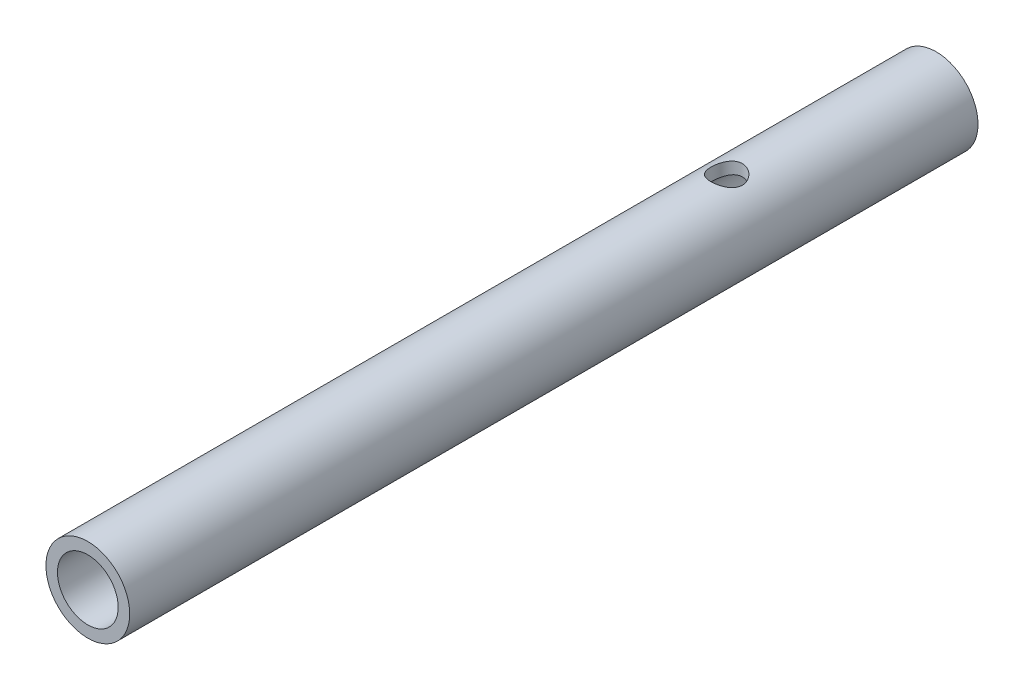
ISO-10303-21;
HEADER;
FILE_DESCRIPTION(('STEP AP214'),'2;1');
FILE_NAME('part.step','',(''),(''),'','','');
FILE_SCHEMA(('AUTOMOTIVE_DESIGN { 1 0 10303 214 1 1 1 1 }'));
ENDSEC;
DATA;
#1=APPLICATION_CONTEXT('core data for automotive mechanical design processes');
#2=APPLICATION_PROTOCOL_DEFINITION('international standard','automotive_design',2000,#1);
#3=PRODUCT_CONTEXT('',#1,'mechanical');
#4=PRODUCT('Part','Part','',(#3));
#5=PRODUCT_RELATED_PRODUCT_CATEGORY('part','',(#4));
#6=PRODUCT_DEFINITION_FORMATION('','',#4);
#7=PRODUCT_DEFINITION_CONTEXT('part definition',#1,'design');
#8=PRODUCT_DEFINITION('design','',#6,#7);
#9=PRODUCT_DEFINITION_SHAPE('','',#8);
#10=(LENGTH_UNIT() NAMED_UNIT(*) SI_UNIT(.MILLI.,.METRE.));
#11=(NAMED_UNIT(*) PLANE_ANGLE_UNIT() SI_UNIT($,.RADIAN.));
#12=(NAMED_UNIT(*) SI_UNIT($,.STERADIAN.) SOLID_ANGLE_UNIT());
#13=UNCERTAINTY_MEASURE_WITH_UNIT(LENGTH_MEASURE(1.E-05),#10,'distance_accuracy_value','');
#14=(GEOMETRIC_REPRESENTATION_CONTEXT(3) GLOBAL_UNCERTAINTY_ASSIGNED_CONTEXT((#13)) GLOBAL_UNIT_ASSIGNED_CONTEXT((#10,
#11,#12)) REPRESENTATION_CONTEXT('',''));
#15=CARTESIAN_POINT('',(0.,0.,0.));
#16=DIRECTION('',(0.,0.,1.));
#17=DIRECTION('',(1.,0.,0.));
#18=AXIS2_PLACEMENT_3D('',#15,#16,#17);
#19=CARTESIAN_POINT('',(0.,0.,81.));
#20=DIRECTION('',(0.,0.,1.));
#21=DIRECTION('',(1.,0.,0.));
#22=AXIS2_PLACEMENT_3D('',#19,#20,#21);
#23=PLANE('',#22);
#24=CARTESIAN_POINT('',(0.,0.,81.));
#25=DIRECTION('',(0.,0.,1.));
#26=DIRECTION('',(1.,0.,0.));
#27=AXIS2_PLACEMENT_3D('',#24,#25,#26);
#28=CIRCLE('',#27,4.);
#29=CARTESIAN_POINT('',(4.,0.,81.));
#30=VERTEX_POINT('',#29);
#31=EDGE_CURVE('E10',#30,#30,#28,.T.);
#32=ORIENTED_EDGE('',*,*,#31,.T.);
#33=EDGE_LOOP('',(#32));
#34=FACE_BOUND('',#33,.T.);
#35=CARTESIAN_POINT('',(0.,0.,81.));
#36=DIRECTION('',(0.,0.,1.));
#37=DIRECTION('',(1.,0.,0.));
#38=AXIS2_PLACEMENT_3D('',#35,#36,#37);
#39=CIRCLE('',#38,2.9);
#40=CARTESIAN_POINT('',(2.9,0.,81.));
#41=VERTEX_POINT('',#40);
#42=EDGE_CURVE('E50',#41,#41,#39,.T.);
#43=ORIENTED_EDGE('',*,*,#42,.F.);
#44=EDGE_LOOP('',(#43));
#45=FACE_BOUND('',#44,.T.);
#46=ADVANCED_FACE('F33',(#34,#45),#23,.T.);
#47=CARTESIAN_POINT('',(0.,0.,0.));
#48=DIRECTION('',(0.,0.,1.));
#49=DIRECTION('',(1.,0.,0.));
#50=AXIS2_PLACEMENT_3D('',#47,#48,#49);
#51=PLANE('',#50);
#52=CARTESIAN_POINT('',(0.,0.,0.));
#53=DIRECTION('',(0.,0.,1.));
#54=DIRECTION('',(1.,0.,0.));
#55=AXIS2_PLACEMENT_3D('',#52,#53,#54);
#56=CIRCLE('',#55,4.);
#57=CARTESIAN_POINT('',(4.,0.,0.));
#58=VERTEX_POINT('',#57);
#59=EDGE_CURVE('E45',#58,#58,#56,.T.);
#60=ORIENTED_EDGE('',*,*,#59,.F.);
#61=EDGE_LOOP('',(#60));
#62=FACE_BOUND('',#61,.T.);
#63=CARTESIAN_POINT('',(0.,0.,0.));
#64=DIRECTION('',(0.,0.,1.));
#65=DIRECTION('',(1.,0.,0.));
#66=AXIS2_PLACEMENT_3D('',#63,#64,#65);
#67=CIRCLE('',#66,2.9);
#68=CARTESIAN_POINT('',(2.9,0.,0.));
#69=VERTEX_POINT('',#68);
#70=EDGE_CURVE('E53',#69,#69,#67,.T.);
#71=ORIENTED_EDGE('',*,*,#70,.T.);
#72=EDGE_LOOP('',(#71));
#73=FACE_BOUND('',#72,.T.);
#74=ADVANCED_FACE('F104',(#62,#73),#51,.F.);
#75=CARTESIAN_POINT('',(0.,0.,81.));
#76=DIRECTION('',(0.,0.,-1.));
#77=DIRECTION('',(-1.,0.,0.));
#78=AXIS2_PLACEMENT_3D('',#75,#76,#77);
#79=CYLINDRICAL_SURFACE('',#78,4.);
#80=CARTESIAN_POINT('',(0.,-4.,21.5));
#81=CARTESIAN_POINT('',(-0.0812350589378493,-4.00000217456151,21.5000029023031));
#82=CARTESIAN_POINT('',(-0.162450241781789,-3.99750379283184,21.4933802397516));
#83=CARTESIAN_POINT('',(-0.322453452352357,-3.98778696006928,21.4671718047301));
#84=CARTESIAN_POINT('',(-0.401241827987612,-3.98056918893993,21.4475878995294));
#85=CARTESIAN_POINT('',(-0.554060784990876,-3.96218832391545,21.3962469982282));
#86=CARTESIAN_POINT('',(-0.628100224162276,-3.9510328434944,21.3645134831782));
#87=CARTESIAN_POINT('',(-0.769799310160252,-3.92588767765353,21.2898935869842));
#88=CARTESIAN_POINT('',(-0.837457239177877,-3.91189723227548,21.2470042144558));
#89=CARTESIAN_POINT('',(-0.967346417045822,-3.88186246971217,21.1493874689291));
#90=CARTESIAN_POINT('',(-1.02927073015119,-3.86576002583566,21.0942697377406));
#91=CARTESIAN_POINT('',(-1.14324421474363,-3.83360220871327,20.9745895653412));
#92=CARTESIAN_POINT('',(-1.19529036359202,-3.81754685135033,20.9100242439121));
#93=CARTESIAN_POINT('',(-1.28998202215985,-3.78662470617731,20.7702825324768));
#94=CARTESIAN_POINT('',(-1.33219393195759,-3.77182648820818,20.6947956334542));
#95=CARTESIAN_POINT('',(-1.40318646334084,-3.74599860237433,20.5371516458315));
#96=CARTESIAN_POINT('',(-1.43197244961239,-3.73496742975881,20.4549972368449));
#97=CARTESIAN_POINT('',(-1.47408431017549,-3.71854412824136,20.2898832597418));
#98=CARTESIAN_POINT('',(-1.48799593218558,-3.71293924350838,20.2070949615646));
#99=CARTESIAN_POINT('',(-1.50179556531648,-3.70738061461215,20.0401838420062));
#100=CARTESIAN_POINT('',(-1.5016893680263,-3.70742453659305,19.9560615861255));
#101=CARTESIAN_POINT('',(-1.48790429610018,-3.71297511632055,19.794230474787));
#102=CARTESIAN_POINT('',(-1.47503808509003,-3.71815468871122,19.7164390939558));
#103=CARTESIAN_POINT('',(-1.4374416786833,-3.7328493805953,19.5642128495947));
#104=CARTESIAN_POINT('',(-1.41270969663258,-3.74236515298863,19.4897784933861));
#105=CARTESIAN_POINT('',(-1.35163748571904,-3.76485702190253,19.3447229322718));
#106=CARTESIAN_POINT('',(-1.315086487371,-3.77789517988166,19.2742005138787));
#107=CARTESIAN_POINT('',(-1.23156073762697,-3.80594210139319,19.140054262409));
#108=CARTESIAN_POINT('',(-1.18458238728896,-3.82095154457158,19.0764328224803));
#109=CARTESIAN_POINT('',(-1.07781780766548,-3.85248038859113,18.9533963363491));
#110=CARTESIAN_POINT('',(-1.01738298716955,-3.86903347455671,18.8945513592519));
#111=CARTESIAN_POINT('',(-0.887312590819018,-3.90091728164086,18.7876620337942));
#112=CARTESIAN_POINT('',(-0.817675603497362,-3.91624781465952,18.7396193453943));
#113=CARTESIAN_POINT('',(-0.669723436992418,-3.9442639480908,18.6550696029375));
#114=CARTESIAN_POINT('',(-0.591290713844717,-3.95690498259616,18.6187524187789));
#115=CARTESIAN_POINT('',(-0.42883685052458,-3.97778718326962,18.56001739573));
#116=CARTESIAN_POINT('',(-0.344818210845764,-3.98603030341493,18.5375933834389));
#117=CARTESIAN_POINT('',(-0.178375243148662,-3.99684443228065,18.5083772124581));
#118=CARTESIAN_POINT('',(-0.0961036195622058,-3.99969369025686,18.5008173936175));
#119=CARTESIAN_POINT('',(0.068572475255028,-4.00025893700126,18.4993089361001));
#120=CARTESIAN_POINT('',(0.150976912983377,-3.99797606386863,18.5053572796832));
#121=CARTESIAN_POINT('',(0.310262048561863,-3.98871709772643,18.5303100423087));
#122=CARTESIAN_POINT('',(0.387233328007339,-3.98192470962305,18.5487115437371));
#123=CARTESIAN_POINT('',(0.536941754957224,-3.96451477091717,18.5971860725473));
#124=CARTESIAN_POINT('',(0.609678350347538,-3.9538967228203,18.627260617948));
#125=CARTESIAN_POINT('',(0.751247765110159,-3.92949624407681,18.6991864124395));
#126=CARTESIAN_POINT('',(0.819903083557799,-3.91563000209348,18.7413577292234));
#127=CARTESIAN_POINT('',(0.949392711726629,-3.88626671564664,18.8359181031716));
#128=CARTESIAN_POINT('',(1.01022412027046,-3.87076907009516,18.8883109325451));
#129=CARTESIAN_POINT('',(1.12603079874455,-3.83873329490989,19.0054041221243));
#130=CARTESIAN_POINT('',(1.18046154123569,-3.82218696503729,19.0706421827727));
#131=CARTESIAN_POINT('',(1.27771050031904,-3.79078815746853,19.2096513847077));
#132=CARTESIAN_POINT('',(1.32052767414519,-3.77593583194399,19.2834232913885));
#133=CARTESIAN_POINT('',(1.39337773518998,-3.74966829822463,19.4380159867723));
#134=CARTESIAN_POINT('',(1.42335685446919,-3.73826760328493,19.5188647459104));
#135=CARTESIAN_POINT('',(1.4690788346689,-3.72054032891005,19.6850097636878));
#136=CARTESIAN_POINT('',(1.48483050305536,-3.7142106105749,19.7703032361981));
#137=CARTESIAN_POINT('',(1.5008634709784,-3.70775894792573,19.9370161595411));
#138=CARTESIAN_POINT('',(1.50207331495838,-3.70726444523341,20.0183326317169));
#139=CARTESIAN_POINT('',(1.49136715641593,-3.71158412745292,20.1799453162762));
#140=CARTESIAN_POINT('',(1.47945239850124,-3.71639780898899,20.2602416246716));
#141=CARTESIAN_POINT('',(1.44355815630242,-3.73048141585432,20.4150472267166));
#142=CARTESIAN_POINT('',(1.41995798316525,-3.73961085376663,20.4896583462453));
#143=CARTESIAN_POINT('',(1.3616969677992,-3.76121548297845,20.6339055084944));
#144=CARTESIAN_POINT('',(1.32703332944945,-3.77369151995214,20.7035402880701));
#145=CARTESIAN_POINT('',(1.24552075938154,-3.80139723903964,20.8398267896976));
#146=CARTESIAN_POINT('',(1.19812832803011,-3.81673698440964,20.9061307967999));
#147=CARTESIAN_POINT('',(1.09334485729907,-3.84806246757177,21.0301415609712));
#148=CARTESIAN_POINT('',(1.03595064012809,-3.86404840943145,21.0878455747868));
#149=CARTESIAN_POINT('',(0.909080396784628,-3.89590424609881,21.1962019558218));
#150=CARTESIAN_POINT('',(0.839118644212998,-3.91172104900644,21.2463037534347));
#151=CARTESIAN_POINT('',(0.691213223200827,-3.9405451445703,21.3340226552766));
#152=CARTESIAN_POINT('',(0.613268934090628,-3.95355221851559,21.3716387877364));
#153=CARTESIAN_POINT('',(0.447999082002318,-3.9757429260668,21.4343768290483));
#154=CARTESIAN_POINT('',(0.360413422234214,-3.98473657158356,21.4588870646019));
#155=CARTESIAN_POINT('',(0.181875733606387,-3.99686242179587,21.4916929599207));
#156=CARTESIAN_POINT('',(0.0909254163648633,-3.99999756603967,21.4999967514873));
#157=CARTESIAN_POINT('',(0.,-4.,21.5));
#158=B_SPLINE_CURVE_WITH_KNOTS('',3,(#80,#81,#82,#83,#84,#85,#86,#87,#88,#89,#90,#91,#92,#93,
#94,#95,#96,#97,#98,#99,#100,#101,#102,#103,#104,#105,#106,#107,#108,#109,#110,#111,#112,#113,
#114,#115,#116,#117,#118,#119,#120,#121,#122,#123,#124,#125,#126,#127,#128,#129,#130,#131,#132,
#133,#134,#135,#136,#137,#138,#139,#140,#141,#142,#143,#144,#145,#146,#147,#148,#149,#150,#151,
#152,#153,#154,#155,#156,#157),.UNSPECIFIED.,.T.,.F.,(4,2,2,2,2,2,2,2,2,2,2,2,2,2,2,2,2,2,2,2,2,
2,2,2,2,2,2,2,2,2,2,2,2,2,2,2,2,2,4),(0.,0.24336980156056,0.486704549530461,0.729571369213575,
0.97250337960949,1.22473618582715,1.47704604925622,1.73896674501659,2.00078269352134,
2.25185874416902,2.50283106079707,2.73878345119972,2.9747713806059,3.21522408387019,
3.45575990744259,3.71246153335813,3.96920257905066,4.22991375286076,4.49050899698846,
4.73725019635926,4.98393668390521,5.2211443792384,5.45838293254454,5.702592218596,
5.94689180019868,6.20536519455659,6.46386178920141,6.72343066727205,6.98283874956507,
7.22558763480253,7.4683135021126,7.70363142426534,7.93900886656507,8.18672471884272,
8.43451941997063,8.6957232965404,8.95694749805103,9.22948515032043,9.50188601796128),.UNSPECIFIED.);
#159=CARTESIAN_POINT('',(0.,-4.,21.5));
#160=VERTEX_POINT('',#159);
#161=EDGE_CURVE('E59',#160,#160,#158,.T.);
#162=ORIENTED_EDGE('',*,*,#161,.F.);
#163=EDGE_LOOP('',(#162));
#164=FACE_BOUND('',#163,.T.);
#165=CARTESIAN_POINT('',(0.,4.,18.5));
#166=CARTESIAN_POINT('',(0.0812350589378568,4.00000217456151,18.4999970976969));
#167=CARTESIAN_POINT('',(0.162450241781796,3.99750379283184,18.5066197602484));
#168=CARTESIAN_POINT('',(0.322453452352365,3.98778696006928,18.5328281952699));
#169=CARTESIAN_POINT('',(0.40124182798762,3.98056918893993,18.5524121004706));
#170=CARTESIAN_POINT('',(0.554060784990883,3.96218832391545,18.6037530017718));
#171=CARTESIAN_POINT('',(0.628100224162282,3.9510328434944,18.6354865168218));
#172=CARTESIAN_POINT('',(0.769799310160258,3.92588767765353,18.7101064130158));
#173=CARTESIAN_POINT('',(0.837457239177885,3.91189723227548,18.7529957855442));
#174=CARTESIAN_POINT('',(0.967346417045831,3.88186246971216,18.8506125310709));
#175=CARTESIAN_POINT('',(1.0292707301512,3.86576002583566,18.9057302622594));
#176=CARTESIAN_POINT('',(1.14324421474364,3.83360220871327,19.0254104346588));
#177=CARTESIAN_POINT('',(1.19529036359203,3.81754685135033,19.0899757560879));
#178=CARTESIAN_POINT('',(1.28998202215986,3.78662470617731,19.2297174675232));
#179=CARTESIAN_POINT('',(1.3321939319576,3.77182648820818,19.3052043665458));
#180=CARTESIAN_POINT('',(1.40318646334085,3.74599860237433,19.4628483541685));
#181=CARTESIAN_POINT('',(1.4319724496124,3.73496742975881,19.5450027631551));
#182=CARTESIAN_POINT('',(1.4740843101755,3.71854412824136,19.7101167402582));
#183=CARTESIAN_POINT('',(1.48799593218558,3.71293924350838,19.7929050384354));
#184=CARTESIAN_POINT('',(1.50179556531648,3.70738061461214,19.9598161579938));
#185=CARTESIAN_POINT('',(1.50168936802631,3.70742453659304,20.0439384138745));
#186=CARTESIAN_POINT('',(1.48790429610019,3.71297511632054,20.205769525213));
#187=CARTESIAN_POINT('',(1.47503808509004,3.71815468871121,20.2835609060442));
#188=CARTESIAN_POINT('',(1.4374416786833,3.73284938059529,20.4357871504053));
#189=CARTESIAN_POINT('',(1.41270969663259,3.74236515298863,20.5102215066139));
#190=CARTESIAN_POINT('',(1.35163748571904,3.76485702190253,20.6552770677282));
#191=CARTESIAN_POINT('',(1.31508648737101,3.77789517988166,20.7257994861213));
#192=CARTESIAN_POINT('',(1.23156073762698,3.80594210139319,20.859945737591));
#193=CARTESIAN_POINT('',(1.18458238728897,3.82095154457158,20.9235671775197));
#194=CARTESIAN_POINT('',(1.07781780766549,3.85248038859113,21.0466036636509));
#195=CARTESIAN_POINT('',(1.01738298716956,3.8690334745567,21.1054486407481));
#196=CARTESIAN_POINT('',(0.887312590819026,3.90091728164085,21.2123379662058));
#197=CARTESIAN_POINT('',(0.817675603497369,3.91624781465952,21.2603806546057));
#198=CARTESIAN_POINT('',(0.669723436992425,3.9442639480908,21.3449303970625));
#199=CARTESIAN_POINT('',(0.591290713844724,3.95690498259616,21.3812475812211));
#200=CARTESIAN_POINT('',(0.428836850524588,3.97778718326962,21.43998260427));
#201=CARTESIAN_POINT('',(0.344818210845772,3.98603030341493,21.4624066165611));
#202=CARTESIAN_POINT('',(0.178375243148669,3.99684443228065,21.4916227875419));
#203=CARTESIAN_POINT('',(0.0961036195622128,3.99969369025686,21.4991826063825));
#204=CARTESIAN_POINT('',(-0.0685724752550212,4.00025893700126,21.5006910638999));
#205=CARTESIAN_POINT('',(-0.15097691298337,3.99797606386863,21.4946427203168));
#206=CARTESIAN_POINT('',(-0.310262048561857,3.98871709772643,21.4696899576913));
#207=CARTESIAN_POINT('',(-0.387233328007334,3.98192470962305,21.4512884562629));
#208=CARTESIAN_POINT('',(-0.536941754957218,3.96451477091717,21.4028139274527));
#209=CARTESIAN_POINT('',(-0.609678350347531,3.9538967228203,21.372739382052));
#210=CARTESIAN_POINT('',(-0.751247765110152,3.92949624407682,21.3008135875605));
#211=CARTESIAN_POINT('',(-0.819903083557793,3.91563000209348,21.2586422707766));
#212=CARTESIAN_POINT('',(-0.949392711726624,3.88626671564664,21.1640818968284));
#213=CARTESIAN_POINT('',(-1.01022412027045,3.87076907009516,21.1116890674549));
#214=CARTESIAN_POINT('',(-1.12603079874454,3.8387332949099,20.9945958778757));
#215=CARTESIAN_POINT('',(-1.18046154123568,3.82218696503729,20.9293578172273));
#216=CARTESIAN_POINT('',(-1.27771050031903,3.79078815746854,20.7903486152923));
#217=CARTESIAN_POINT('',(-1.32052767414518,3.77593583194399,20.7165767086115));
#218=CARTESIAN_POINT('',(-1.39337773518997,3.74966829822463,20.5619840132277));
#219=CARTESIAN_POINT('',(-1.42335685446918,3.73826760328493,20.4811352540896));
#220=CARTESIAN_POINT('',(-1.46907883466889,3.72054032891005,20.3149902363122));
#221=CARTESIAN_POINT('',(-1.48483050305535,3.71421061057491,20.2296967638019));
#222=CARTESIAN_POINT('',(-1.50086347097839,3.70775894792573,20.0629838404589));
#223=CARTESIAN_POINT('',(-1.50207331495837,3.70726444523341,19.9816673682831));
#224=CARTESIAN_POINT('',(-1.49136715641592,3.71158412745292,19.8200546837238));
#225=CARTESIAN_POINT('',(-1.47945239850123,3.71639780898899,19.7397583753284));
#226=CARTESIAN_POINT('',(-1.44355815630241,3.73048141585433,19.5849527732834));
#227=CARTESIAN_POINT('',(-1.41995798316524,3.73961085376663,19.5103416537547));
#228=CARTESIAN_POINT('',(-1.36169696779919,3.76121548297845,19.3660944915056));
#229=CARTESIAN_POINT('',(-1.32703332944944,3.77369151995215,19.2964597119299));
#230=CARTESIAN_POINT('',(-1.24552075938154,3.80139723903965,19.1601732103024));
#231=CARTESIAN_POINT('',(-1.1981283280301,3.81673698440964,19.0938692032001));
#232=CARTESIAN_POINT('',(-1.09334485729906,3.84806246757177,18.9698584390288));
#233=CARTESIAN_POINT('',(-1.03595064012808,3.86404840943145,18.9121544252132));
#234=CARTESIAN_POINT('',(-0.909080396784617,3.89590424609881,18.8037980441782));
#235=CARTESIAN_POINT('',(-0.839118644212987,3.91172104900645,18.7536962465653));
#236=CARTESIAN_POINT('',(-0.691213223200817,3.94054514457031,18.6659773447234));
#237=CARTESIAN_POINT('',(-0.613268934090618,3.95355221851559,18.6283612122636));
#238=CARTESIAN_POINT('',(-0.447999082002309,3.9757429260668,18.5656231709517));
#239=CARTESIAN_POINT('',(-0.360413422234205,3.98473657158356,18.5411129353981));
#240=CARTESIAN_POINT('',(-0.181875733606378,3.99686242179587,18.5083070400793));
#241=CARTESIAN_POINT('',(-0.0909254163648552,3.99999756603967,18.5000032485127));
#242=CARTESIAN_POINT('',(0.,4.,18.5));
#243=B_SPLINE_CURVE_WITH_KNOTS('',3,(#165,#166,#167,#168,#169,#170,#171,#172,#173,#174,#175,
#176,#177,#178,#179,#180,#181,#182,#183,#184,#185,#186,#187,#188,#189,#190,#191,#192,#193,#194,
#195,#196,#197,#198,#199,#200,#201,#202,#203,#204,#205,#206,#207,#208,#209,#210,#211,#212,#213,
#214,#215,#216,#217,#218,#219,#220,#221,#222,#223,#224,#225,#226,#227,#228,#229,#230,#231,#232,
#233,#234,#235,#236,#237,#238,#239,#240,#241,#242),.UNSPECIFIED.,.T.,.F.,(4,2,2,2,2,2,2,2,2,2,2,
2,2,2,2,2,2,2,2,2,2,2,2,2,2,2,2,2,2,2,2,2,2,2,2,2,2,2,4),(0.,0.24336980156056,0.486704549530461,
0.729571369213573,0.972503379609491,1.22473618582715,1.47704604925622,1.73896674501659,
2.00078269352134,2.25185874416902,2.50283106079707,2.73878345119972,2.9747713806059,
3.21522408387019,3.45575990744259,3.71246153335813,3.96920257905066,4.22991375286076,
4.49050899698846,4.73725019635926,4.98393668390521,5.22114437923841,5.45838293254454,
5.702592218596,5.94689180019869,6.20536519455658,6.46386178920142,6.72343066727205,
6.98283874956508,7.22558763480253,7.4683135021126,7.70363142426535,7.93900886656507,
8.18672471884272,8.43451941997063,8.6957232965404,8.95694749805103,9.22948515032043,
9.50188601796129),.UNSPECIFIED.);
#244=CARTESIAN_POINT('',(0.,4.,18.5));
#245=VERTEX_POINT('',#244);
#246=EDGE_CURVE('E80',#245,#245,#243,.T.);
#247=ORIENTED_EDGE('',*,*,#246,.T.);
#248=EDGE_LOOP('',(#247));
#249=FACE_BOUND('',#248,.T.);
#250=ORIENTED_EDGE('',*,*,#31,.F.);
#251=EDGE_LOOP('',(#250));
#252=FACE_BOUND('',#251,.T.);
#253=ORIENTED_EDGE('',*,*,#59,.T.);
#254=EDGE_LOOP('',(#253));
#255=FACE_BOUND('',#254,.T.);
#256=ADVANCED_FACE('F35',(#164,#249,#252,#255),#79,.T.);
#257=CARTESIAN_POINT('',(0.,0.,81.));
#258=DIRECTION('',(0.,0.,-1.));
#259=DIRECTION('',(-1.,0.,0.));
#260=AXIS2_PLACEMENT_3D('',#257,#258,#259);
#261=CYLINDRICAL_SURFACE('',#260,2.9);
#262=CARTESIAN_POINT('',(0.,-2.9,21.5));
#263=CARTESIAN_POINT('',(0.0785281053013056,-2.8999955161642,21.4999949093055));
#264=CARTESIAN_POINT('',(0.157139881791002,-2.89677669061094,21.4937972489547));
#265=CARTESIAN_POINT('',(0.312019206028309,-2.88421715417955,21.4692906361974));
#266=CARTESIAN_POINT('',(0.388282481423316,-2.87486590515394,21.4509608350375));
#267=CARTESIAN_POINT('',(0.535992300960559,-2.85101535462591,21.4031092795851));
#268=CARTESIAN_POINT('',(0.607456668638787,-2.83653651815397,21.3736319854578));
#269=CARTESIAN_POINT('',(0.744307923623687,-2.80374117775437,21.3045637666606));
#270=CARTESIAN_POINT('',(0.809695022052255,-2.78542480721309,21.264973193501));
#271=CARTESIAN_POINT('',(0.937199253652447,-2.7452512159075,21.1739576513413));
#272=CARTESIAN_POINT('',(0.998845999295431,-2.72324310324875,21.1219413743298));
#273=CARTESIAN_POINT('',(1.11297880929229,-2.67862657216473,21.0088321914973));
#274=CARTESIAN_POINT('',(1.16545736370434,-2.65601767892338,20.9477319198234));
#275=CARTESIAN_POINT('',(1.2642199755428,-2.61054547351333,20.8120163094887));
#276=CARTESIAN_POINT('',(1.30960663376335,-2.58782191954358,20.7366953769526));
#277=CARTESIAN_POINT('',(1.38687899119835,-2.54725016043672,20.5782058726435));
#278=CARTESIAN_POINT('',(1.41877478489652,-2.52939831362628,20.4950432255868));
#279=CARTESIAN_POINT('',(1.46600730380236,-2.50230456867866,20.3284027445208));
#280=CARTESIAN_POINT('',(1.48224103407722,-2.4926010543748,20.2452582194879));
#281=CARTESIAN_POINT('',(1.50041031054414,-2.48171205655829,20.076907882029));
#282=CARTESIAN_POINT('',(1.50236187998017,-2.48051702736479,19.991704487213));
#283=CARTESIAN_POINT('',(1.49256730162753,-2.48641408378851,19.83360579867));
#284=CARTESIAN_POINT('',(1.48257162314017,-2.49244737896204,19.7605524436353));
#285=CARTESIAN_POINT('',(1.45222064348666,-2.51025132899941,19.6173588543817));
#286=CARTESIAN_POINT('',(1.43186162800651,-2.52202404085829,19.5472196743852));
#287=CARTESIAN_POINT('',(1.38101731867427,-2.5502251788653,19.4098445432735));
#288=CARTESIAN_POINT('',(1.35030974552706,-2.56675452350768,19.34271256666));
#289=CARTESIAN_POINT('',(1.27981618141518,-2.60262044910504,19.214222080244));
#290=CARTESIAN_POINT('',(1.24002611749046,-2.62195828808419,19.1528661781577));
#291=CARTESIAN_POINT('',(1.14615167307872,-2.66445806593622,19.0288229046281));
#292=CARTESIAN_POINT('',(1.09085591565219,-2.68778100876222,18.9671041419278));
#293=CARTESIAN_POINT('',(0.970643304321419,-2.73349383876559,18.8533956930842));
#294=CARTESIAN_POINT('',(0.90572125285781,-2.75588321345865,18.8014112973796));
#295=CARTESIAN_POINT('',(0.763773565769116,-2.79864653823148,18.7060386474362));
#296=CARTESIAN_POINT('',(0.686289237319935,-2.81885114084246,18.6632508498363));
#297=CARTESIAN_POINT('',(0.523915902480573,-2.85348555203439,18.5916801988097));
#298=CARTESIAN_POINT('',(0.439033227205564,-2.86792024023891,18.562885506931));
#299=CARTESIAN_POINT('',(0.272143849618,-2.88831848701327,18.52261845469));
#300=CARTESIAN_POINT('',(0.190524174433777,-2.89490714089137,18.5098624458529));
#301=CARTESIAN_POINT('',(0.0260506151767444,-2.90104794643901,18.4979652044286));
#302=CARTESIAN_POINT('',(-0.0568025978497374,-2.90060379359961,18.4988168215176));
#303=CARTESIAN_POINT('',(-0.21395857752755,-2.89307669107186,18.5134189883097));
#304=CARTESIAN_POINT('',(-0.288393936908829,-2.88655582152856,18.5260775179174));
#305=CARTESIAN_POINT('',(-0.433918921364024,-2.86829119082404,18.5621765908337));
#306=CARTESIAN_POINT('',(-0.505008187755273,-2.85654687114143,18.5856182871498));
#307=CARTESIAN_POINT('',(-0.644059286710559,-2.82849030850558,18.6431639090429));
#308=CARTESIAN_POINT('',(-0.711885482311183,-2.81206364817789,18.6775377780052));
#309=CARTESIAN_POINT('',(-0.841018103900149,-2.77618209247274,18.7556567254803));
#310=CARTESIAN_POINT('',(-0.9023218409037,-2.75672595622727,18.799405646773));
#311=CARTESIAN_POINT('',(-1.02339228433633,-2.71425791146629,18.9002280952274));
#312=CARTESIAN_POINT('',(-1.08234686310622,-2.69108627946765,18.9582109686823));
#313=CARTESIAN_POINT('',(-1.19008310166712,-2.64521038406813,19.0832022793398));
#314=CARTESIAN_POINT('',(-1.23885649930177,-2.62250651362312,19.1502179747774));
#315=CARTESIAN_POINT('',(-1.32754748731324,-2.57879895961146,19.2962077224052));
#316=CARTESIAN_POINT('',(-1.36678932227871,-2.55796967903992,19.3756493533152));
#317=CARTESIAN_POINT('',(-1.43093282162708,-2.5226553576514,19.5414144206756));
#318=CARTESIAN_POINT('',(-1.45585409805668,-2.50816164679831,19.6277282601616));
#319=CARTESIAN_POINT('',(-1.48825473914737,-2.48906017384358,19.7958167193738));
#320=CARTESIAN_POINT('',(-1.49719888083394,-2.48362569622652,19.8772123180777));
#321=CARTESIAN_POINT('',(-1.50167206738314,-2.48092594814788,20.0404891613269));
#322=CARTESIAN_POINT('',(-1.49720844877152,-2.48365621005941,20.1223701158206));
#323=CARTESIAN_POINT('',(-1.47638457222973,-2.49607773472421,20.2748943730617));
#324=CARTESIAN_POINT('',(-1.46136614065821,-2.50498247167155,20.3457938012452));
#325=CARTESIAN_POINT('',(-1.42160184628089,-2.5277598805951,20.4839625414034));
#326=CARTESIAN_POINT('',(-1.39685264834014,-2.54163425572605,20.5512305997582));
#327=CARTESIAN_POINT('',(-1.33651378721703,-2.57390208275202,20.6851878415328));
#328=CARTESIAN_POINT('',(-1.30031422338288,-2.59253415050249,20.7515429967162));
#329=CARTESIAN_POINT('',(-1.21874055222675,-2.63186658421079,20.8776786099426));
#330=CARTESIAN_POINT('',(-1.17336153823221,-2.65256805331531,20.9374555252354));
#331=CARTESIAN_POINT('',(-1.06764370910757,-2.69700627867627,21.0570354704521));
#332=CARTESIAN_POINT('',(-1.00611723433214,-2.72077992412558,21.115780629239));
#333=CARTESIAN_POINT('',(-0.873495381412511,-2.76620981769611,21.2223931052667));
#334=CARTESIAN_POINT('',(-0.802394402338922,-2.78786481354253,21.2702540109981));
#335=CARTESIAN_POINT('',(-0.650966139555165,-2.82709239718685,21.3541973275044));
#336=CARTESIAN_POINT('',(-0.570514241110525,-2.84459739009977,21.3900881426314));
#337=CARTESIAN_POINT('',(-0.403626301400708,-2.87301141600329,21.4473491545109));
#338=CARTESIAN_POINT('',(-0.31720750528563,-2.88393863781422,21.4687594132992));
#339=CARTESIAN_POINT('',(-0.191520528992023,-2.89392110622578,21.4882196873764));
#340=CARTESIAN_POINT('',(-0.153393383514174,-2.89619380045097,21.4926300562864));
#341=CARTESIAN_POINT('',(-0.0768508447254467,-2.89923436279848,21.4985214937596));
#342=CARTESIAN_POINT('',(-0.03843544448089,-2.90000219460563,21.5000024916315));
#343=CARTESIAN_POINT('',(0.,-2.9,21.5));
#344=B_SPLINE_CURVE_WITH_KNOTS('',3,(#262,#263,#264,#265,#266,#267,#268,#269,#270,#271,#272,
#273,#274,#275,#276,#277,#278,#279,#280,#281,#282,#283,#284,#285,#286,#287,#288,#289,#290,#291,
#292,#293,#294,#295,#296,#297,#298,#299,#300,#301,#302,#303,#304,#305,#306,#307,#308,#309,#310,
#311,#312,#313,#314,#315,#316,#317,#318,#319,#320,#321,#322,#323,#324,#325,#326,#327,#328,#329,
#330,#331,#332,#333,#334,#335,#336,#337,#338,#339,#340,#341,#342,#343),.UNSPECIFIED.,.T.,.F.,(4,
2,2,2,2,2,2,2,2,2,2,2,2,2,2,2,2,2,2,2,2,2,2,2,2,2,2,2,2,2,2,2,2,2,2,2,2,2,2,2,4),(0.,
0.235428837968244,0.471263308068689,0.706166940145712,0.941062408712166,1.19085521437965,
1.440851683159,1.71196047408964,1.98286604857864,2.23712678830275,2.49110222754838,
2.71200795412713,2.93299291112784,3.15906400452884,3.38523667731432,3.64238669336772,
3.89967606237957,4.17058054896784,4.44125544411106,4.68850125708556,4.93561715544778,
5.16192793557688,5.38826291997838,5.62068853200102,5.85320959679924,6.10973677333855,
6.36647132248036,6.63806187504124,6.90927959162382,7.15402989770007,7.39864630447289,
7.61675046395384,7.83492944198129,8.06757275129015,8.30034074511954,8.56412475442971,
8.82806374892545,9.09604461557823,9.36328101758283,9.47850847199804,9.59373870703568),.UNSPECIFIED.);
#345=CARTESIAN_POINT('',(0.,-2.9,21.5));
#346=VERTEX_POINT('',#345);
#347=EDGE_CURVE('E37',#346,#346,#344,.T.);
#348=ORIENTED_EDGE('',*,*,#347,.F.);
#349=EDGE_LOOP('',(#348));
#350=FACE_BOUND('',#349,.T.);
#351=CARTESIAN_POINT('',(0.,2.9,21.5));
#352=CARTESIAN_POINT('',(-0.078528105301298,2.8999955161642,21.4999949093055));
#353=CARTESIAN_POINT('',(-0.157139881790995,2.89677669061094,21.4937972489547));
#354=CARTESIAN_POINT('',(-0.312019206028301,2.88421715417955,21.4692906361974));
#355=CARTESIAN_POINT('',(-0.388282481423309,2.87486590515394,21.4509608350375));
#356=CARTESIAN_POINT('',(-0.535992300960551,2.85101535462591,21.4031092795851));
#357=CARTESIAN_POINT('',(-0.60745666863878,2.83653651815398,21.3736319854578));
#358=CARTESIAN_POINT('',(-0.744307923623679,2.80374117775438,21.3045637666606));
#359=CARTESIAN_POINT('',(-0.809695022052248,2.78542480721309,21.264973193501));
#360=CARTESIAN_POINT('',(-0.937199253652438,2.74525121590751,21.1739576513413));
#361=CARTESIAN_POINT('',(-0.998845999295422,2.72324310324875,21.1219413743298));
#362=CARTESIAN_POINT('',(-1.11297880929228,2.67862657216473,21.0088321914973));
#363=CARTESIAN_POINT('',(-1.16545736370433,2.65601767892338,20.9477319198234));
#364=CARTESIAN_POINT('',(-1.26421997554279,2.61054547351333,20.8120163094887));
#365=CARTESIAN_POINT('',(-1.30960663376334,2.58782191954359,20.7366953769526));
#366=CARTESIAN_POINT('',(-1.38687899119834,2.54725016043673,20.5782058726435));
#367=CARTESIAN_POINT('',(-1.41877478489651,2.52939831362628,20.4950432255868));
#368=CARTESIAN_POINT('',(-1.46600730380235,2.50230456867867,20.3284027445208));
#369=CARTESIAN_POINT('',(-1.48224103407721,2.4926010543748,20.2452582194879));
#370=CARTESIAN_POINT('',(-1.50041031054413,2.4817120565583,20.076907882029));
#371=CARTESIAN_POINT('',(-1.50236187998016,2.48051702736479,19.991704487213));
#372=CARTESIAN_POINT('',(-1.49256730162752,2.48641408378852,19.83360579867));
#373=CARTESIAN_POINT('',(-1.48257162314017,2.49244737896204,19.7605524436353));
#374=CARTESIAN_POINT('',(-1.45222064348665,2.51025132899941,19.6173588543817));
#375=CARTESIAN_POINT('',(-1.43186162800651,2.52202404085829,19.5472196743852));
#376=CARTESIAN_POINT('',(-1.38101731867426,2.5502251788653,19.4098445432735));
#377=CARTESIAN_POINT('',(-1.35030974552705,2.56675452350769,19.34271256666));
#378=CARTESIAN_POINT('',(-1.27981618141517,2.60262044910504,19.214222080244));
#379=CARTESIAN_POINT('',(-1.24002611749045,2.62195828808419,19.1528661781577));
#380=CARTESIAN_POINT('',(-1.14615167307871,2.66445806593623,19.0288229046281));
#381=CARTESIAN_POINT('',(-1.09085591565218,2.68778100876222,18.9671041419278));
#382=CARTESIAN_POINT('',(-0.970643304321409,2.73349383876559,18.8533956930842));
#383=CARTESIAN_POINT('',(-0.905721252857801,2.75588321345865,18.8014112973796));
#384=CARTESIAN_POINT('',(-0.763773565769107,2.79864653823148,18.7060386474362));
#385=CARTESIAN_POINT('',(-0.686289237319926,2.81885114084247,18.6632508498363));
#386=CARTESIAN_POINT('',(-0.523915902480564,2.85348555203439,18.5916801988097));
#387=CARTESIAN_POINT('',(-0.439033227205555,2.86792024023891,18.562885506931));
#388=CARTESIAN_POINT('',(-0.272143849617991,2.88831848701327,18.52261845469));
#389=CARTESIAN_POINT('',(-0.190524174433768,2.89490714089137,18.5098624458529));
#390=CARTESIAN_POINT('',(-0.0260506151767358,2.90104794643901,18.4979652044286));
#391=CARTESIAN_POINT('',(0.0568025978497457,2.90060379359961,18.4988168215176));
#392=CARTESIAN_POINT('',(0.213958577527558,2.89307669107186,18.5134189883097));
#393=CARTESIAN_POINT('',(0.288393936908837,2.88655582152856,18.5260775179174));
#394=CARTESIAN_POINT('',(0.433918921364032,2.86829119082404,18.5621765908337));
#395=CARTESIAN_POINT('',(0.505008187755281,2.85654687114143,18.5856182871498));
#396=CARTESIAN_POINT('',(0.644059286710567,2.82849030850558,18.6431639090429));
#397=CARTESIAN_POINT('',(0.711885482311191,2.81206364817789,18.6775377780052));
#398=CARTESIAN_POINT('',(0.841018103900157,2.77618209247274,18.7556567254803));
#399=CARTESIAN_POINT('',(0.902321840903708,2.75672595622726,18.799405646773));
#400=CARTESIAN_POINT('',(1.02339228433634,2.71425791146629,18.9002280952274));
#401=CARTESIAN_POINT('',(1.08234686310623,2.69108627946765,18.9582109686823));
#402=CARTESIAN_POINT('',(1.19008310166713,2.64521038406813,19.0832022793398));
#403=CARTESIAN_POINT('',(1.23885649930178,2.62250651362312,19.1502179747774));
#404=CARTESIAN_POINT('',(1.32754748731325,2.57879895961146,19.2962077224052));
#405=CARTESIAN_POINT('',(1.36678932227872,2.55796967903992,19.3756493533152));
#406=CARTESIAN_POINT('',(1.43093282162709,2.5226553576514,19.5414144206756));
#407=CARTESIAN_POINT('',(1.45585409805669,2.5081616467983,19.6277282601616));
#408=CARTESIAN_POINT('',(1.48825473914737,2.48906017384357,19.7958167193738));
#409=CARTESIAN_POINT('',(1.49719888083394,2.48362569622651,19.8772123180777));
#410=CARTESIAN_POINT('',(1.50167206738315,2.48092594814788,20.0404891613269));
#411=CARTESIAN_POINT('',(1.49720844877153,2.48365621005941,20.1223701158206));
#412=CARTESIAN_POINT('',(1.47638457222974,2.4960777347242,20.2748943730617));
#413=CARTESIAN_POINT('',(1.46136614065822,2.50498247167154,20.3457938012452));
#414=CARTESIAN_POINT('',(1.4216018462809,2.5277598805951,20.4839625414033));
#415=CARTESIAN_POINT('',(1.39685264834015,2.54163425572604,20.5512305997582));
#416=CARTESIAN_POINT('',(1.33651378721704,2.57390208275202,20.6851878415328));
#417=CARTESIAN_POINT('',(1.30031422338289,2.59253415050249,20.7515429967162));
#418=CARTESIAN_POINT('',(1.21874055222676,2.63186658421079,20.8776786099426));
#419=CARTESIAN_POINT('',(1.17336153823222,2.65256805331531,20.9374555252354));
#420=CARTESIAN_POINT('',(1.06764370910758,2.69700627867626,21.0570354704521));
#421=CARTESIAN_POINT('',(1.00611723433215,2.72077992412558,21.115780629239));
#422=CARTESIAN_POINT('',(0.873495381412519,2.76620981769611,21.2223931052667));
#423=CARTESIAN_POINT('',(0.802394402338931,2.78786481354253,21.2702540109981));
#424=CARTESIAN_POINT('',(0.650966139555175,2.82709239718685,21.3541973275044));
#425=CARTESIAN_POINT('',(0.570514241110534,2.84459739009977,21.3900881426314));
#426=CARTESIAN_POINT('',(0.403626301400717,2.87301141600329,21.4473491545109));
#427=CARTESIAN_POINT('',(0.317207505285638,2.88393863781422,21.4687594132992));
#428=CARTESIAN_POINT('',(0.19152052899203,2.89392110622578,21.4882196873764));
#429=CARTESIAN_POINT('',(0.153393383514181,2.89619380045097,21.4926300562864));
#430=CARTESIAN_POINT('',(0.0768508447254541,2.89923436279848,21.4985214937596));
#431=CARTESIAN_POINT('',(0.0384354444808975,2.90000219460563,21.5000024916315));
#432=CARTESIAN_POINT('',(0.,2.9,21.5));
#433=B_SPLINE_CURVE_WITH_KNOTS('',3,(#351,#352,#353,#354,#355,#356,#357,#358,#359,#360,#361,
#362,#363,#364,#365,#366,#367,#368,#369,#370,#371,#372,#373,#374,#375,#376,#377,#378,#379,#380,
#381,#382,#383,#384,#385,#386,#387,#388,#389,#390,#391,#392,#393,#394,#395,#396,#397,#398,#399,
#400,#401,#402,#403,#404,#405,#406,#407,#408,#409,#410,#411,#412,#413,#414,#415,#416,#417,#418,
#419,#420,#421,#422,#423,#424,#425,#426,#427,#428,#429,#430,#431,#432),.UNSPECIFIED.,.T.,.F.,(4,
2,2,2,2,2,2,2,2,2,2,2,2,2,2,2,2,2,2,2,2,2,2,2,2,2,2,2,2,2,2,2,2,2,2,2,2,2,2,2,4),(0.,
0.235428837968244,0.471263308068689,0.706166940145712,0.941062408712166,1.19085521437965,
1.440851683159,1.71196047408964,1.98286604857864,2.23712678830274,2.49110222754838,
2.71200795412713,2.93299291112784,3.15906400452884,3.38523667731432,3.64238669336773,
3.89967606237958,4.17058054896784,4.44125544411106,4.68850125708556,4.93561715544778,
5.16192793557688,5.38826291997838,5.62068853200102,5.85320959679924,6.10973677333855,
6.36647132248036,6.63806187504123,6.90927959162382,7.15402989770007,7.39864630447289,
7.61675046395384,7.83492944198129,8.06757275129015,8.30034074511954,8.56412475442972,
8.82806374892545,9.09604461557823,9.36328101758284,9.47850847199804,9.59373870703568),.UNSPECIFIED.);
#434=CARTESIAN_POINT('',(0.,2.9,21.5));
#435=VERTEX_POINT('',#434);
#436=EDGE_CURVE('E55',#435,#435,#433,.T.);
#437=ORIENTED_EDGE('',*,*,#436,.F.);
#438=EDGE_LOOP('',(#437));
#439=FACE_BOUND('',#438,.T.);
#440=ORIENTED_EDGE('',*,*,#42,.T.);
#441=EDGE_LOOP('',(#440));
#442=FACE_BOUND('',#441,.T.);
#443=ORIENTED_EDGE('',*,*,#70,.F.);
#444=EDGE_LOOP('',(#443));
#445=FACE_BOUND('',#444,.T.);
#446=ADVANCED_FACE('F60',(#350,#439,#442,#445),#261,.F.);
#447=CARTESIAN_POINT('',(0.,-4.001,20.));
#448=DIRECTION('',(0.,1.,0.));
#449=DIRECTION('',(0.,0.,1.));
#450=AXIS2_PLACEMENT_3D('',#447,#448,#449);
#451=CYLINDRICAL_SURFACE('',#450,1.5);
#452=ORIENTED_EDGE('',*,*,#436,.T.);
#453=EDGE_LOOP('',(#452));
#454=FACE_BOUND('',#453,.T.);
#455=ORIENTED_EDGE('',*,*,#246,.F.);
#456=EDGE_LOOP('',(#455));
#457=FACE_BOUND('',#456,.T.);
#458=ADVANCED_FACE('F64',(#454,#457),#451,.F.);
#459=ORIENTED_EDGE('',*,*,#347,.T.);
#460=EDGE_LOOP('',(#459));
#461=FACE_BOUND('',#460,.T.);
#462=ORIENTED_EDGE('',*,*,#161,.T.);
#463=EDGE_LOOP('',(#462));
#464=FACE_BOUND('',#463,.T.);
#465=ADVANCED_FACE('F68',(#461,#464),#451,.F.);
#466=CLOSED_SHELL('',(#46,#74,#256,#446,#458,#465));
#467=MANIFOLD_SOLID_BREP('B2',#466);
#468=ADVANCED_BREP_SHAPE_REPRESENTATION('',(#18,#467),#14);
#469=SHAPE_DEFINITION_REPRESENTATION(#9,#468);
ENDSEC;
END-ISO-10303-21;
